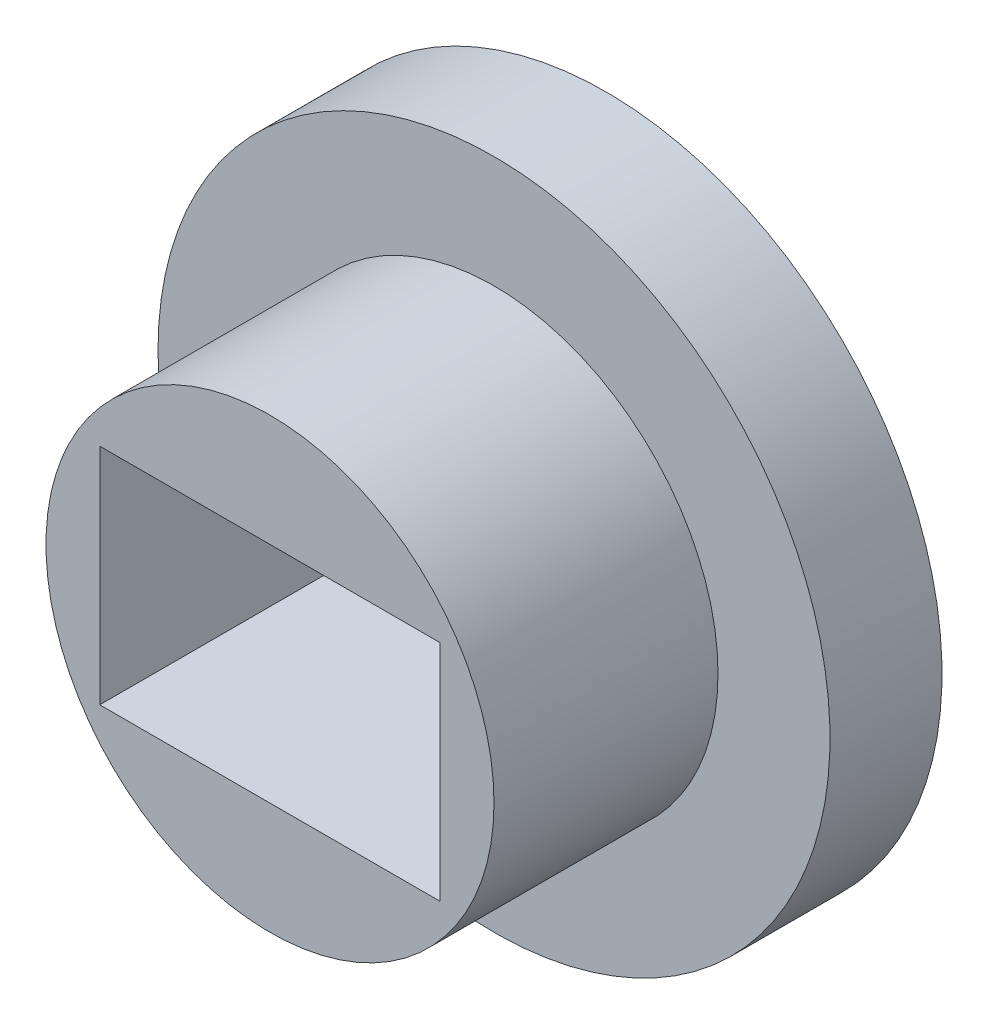
ISO-10303-21;
HEADER;
FILE_DESCRIPTION(('STEP AP214'),'2;1');
FILE_NAME('part.step','',(''),(''),'','','');
FILE_SCHEMA(('AUTOMOTIVE_DESIGN { 1 0 10303 214 1 1 1 1 }'));
ENDSEC;
DATA;
#1=APPLICATION_CONTEXT('core data for automotive mechanical design processes');
#2=APPLICATION_PROTOCOL_DEFINITION('international standard','automotive_design',2000,#1);
#3=PRODUCT_CONTEXT('',#1,'mechanical');
#4=PRODUCT('Part','Part','',(#3));
#5=PRODUCT_RELATED_PRODUCT_CATEGORY('part','',(#4));
#6=PRODUCT_DEFINITION_FORMATION('','',#4);
#7=PRODUCT_DEFINITION_CONTEXT('part definition',#1,'design');
#8=PRODUCT_DEFINITION('design','',#6,#7);
#9=PRODUCT_DEFINITION_SHAPE('','',#8);
#10=(LENGTH_UNIT() NAMED_UNIT(*) SI_UNIT(.MILLI.,.METRE.));
#11=(NAMED_UNIT(*) PLANE_ANGLE_UNIT() SI_UNIT($,.RADIAN.));
#12=(NAMED_UNIT(*) SI_UNIT($,.STERADIAN.) SOLID_ANGLE_UNIT());
#13=UNCERTAINTY_MEASURE_WITH_UNIT(LENGTH_MEASURE(1.E-05),#10,'distance_accuracy_value','');
#14=(GEOMETRIC_REPRESENTATION_CONTEXT(3) GLOBAL_UNCERTAINTY_ASSIGNED_CONTEXT((#13)) GLOBAL_UNIT_ASSIGNED_CONTEXT((#10,
#11,#12)) REPRESENTATION_CONTEXT('',''));
#15=CARTESIAN_POINT('',(0.,0.,0.));
#16=DIRECTION('',(0.,0.,1.));
#17=DIRECTION('',(1.,0.,0.));
#18=AXIS2_PLACEMENT_3D('',#15,#16,#17);
#19=CARTESIAN_POINT('',(0.,0.,6.35));
#20=DIRECTION('',(0.,0.,-1.));
#21=DIRECTION('',(-1.,0.,0.));
#22=AXIS2_PLACEMENT_3D('',#19,#20,#21);
#23=CYLINDRICAL_SURFACE('',#22,6.35);
#24=CARTESIAN_POINT('',(0.,0.,6.35));
#25=DIRECTION('',(0.,0.,1.));
#26=DIRECTION('',(1.,0.,0.));
#27=AXIS2_PLACEMENT_3D('',#24,#25,#26);
#28=CIRCLE('',#27,6.35);
#29=CARTESIAN_POINT('',(6.35,0.,6.35));
#30=VERTEX_POINT('',#29);
#31=EDGE_CURVE('E11',#30,#30,#28,.T.);
#32=ORIENTED_EDGE('',*,*,#31,.F.);
#33=EDGE_LOOP('',(#32));
#34=FACE_BOUND('',#33,.T.);
#35=CARTESIAN_POINT('',(0.,0.,0.));
#36=DIRECTION('',(0.,0.,1.));
#37=DIRECTION('',(1.,0.,0.));
#38=AXIS2_PLACEMENT_3D('',#35,#36,#37);
#39=CIRCLE('',#38,6.35);
#40=CARTESIAN_POINT('',(6.35,0.,0.));
#41=VERTEX_POINT('',#40);
#42=EDGE_CURVE('E42',#41,#41,#39,.T.);
#43=ORIENTED_EDGE('',*,*,#42,.T.);
#44=EDGE_LOOP('',(#43));
#45=FACE_BOUND('',#44,.T.);
#46=ADVANCED_FACE('F39',(#34,#45),#23,.T.);
#47=CARTESIAN_POINT('',(0.,0.,6.35));
#48=DIRECTION('',(0.,0.,1.));
#49=DIRECTION('',(1.,0.,0.));
#50=AXIS2_PLACEMENT_3D('',#47,#48,#49);
#51=PLANE('',#50);
#52=DIRECTION('',(0.,-1.,0.));
#53=VECTOR('',#52,1.);
#54=CARTESIAN_POINT('',(4.826,-3.175,6.35));
#55=LINE('',#54,#53);
#56=CARTESIAN_POINT('',(4.826,3.175,6.35));
#57=VERTEX_POINT('',#56);
#58=CARTESIAN_POINT('',(4.826,-3.175,6.35));
#59=VERTEX_POINT('',#58);
#60=EDGE_CURVE('E82',#57,#59,#55,.T.);
#61=ORIENTED_EDGE('',*,*,#60,.T.);
#62=DIRECTION('',(-1.,0.,0.));
#63=VECTOR('',#62,1.);
#64=CARTESIAN_POINT('',(-4.826,-3.175,6.35));
#65=LINE('',#64,#63);
#66=CARTESIAN_POINT('',(-4.826,-3.175,6.35));
#67=VERTEX_POINT('',#66);
#68=EDGE_CURVE('E92',#59,#67,#65,.T.);
#69=ORIENTED_EDGE('',*,*,#68,.T.);
#70=DIRECTION('',(0.,1.,0.));
#71=VECTOR('',#70,1.);
#72=CARTESIAN_POINT('',(-4.826,-3.175,6.35));
#73=LINE('',#72,#71);
#74=CARTESIAN_POINT('',(-4.826,3.175,6.35));
#75=VERTEX_POINT('',#74);
#76=EDGE_CURVE('E54',#67,#75,#73,.T.);
#77=ORIENTED_EDGE('',*,*,#76,.T.);
#78=DIRECTION('',(1.,0.,0.));
#79=VECTOR('',#78,1.);
#80=CARTESIAN_POINT('',(-4.826,3.175,6.35));
#81=LINE('',#80,#79);
#82=EDGE_CURVE('E89',#75,#57,#81,.T.);
#83=ORIENTED_EDGE('',*,*,#82,.T.);
#84=EDGE_LOOP('',(#61,#69,#77,#83));
#85=FACE_BOUND('',#84,.T.);
#86=ORIENTED_EDGE('',*,*,#31,.T.);
#87=EDGE_LOOP('',(#86));
#88=FACE_BOUND('',#87,.T.);
#89=ADVANCED_FACE('F97',(#85,#88),#51,.T.);
#90=CARTESIAN_POINT('',(0.,0.,-3.175));
#91=DIRECTION('',(0.,0.,1.));
#92=DIRECTION('',(1.,0.,0.));
#93=AXIS2_PLACEMENT_3D('',#90,#91,#92);
#94=CYLINDRICAL_SURFACE('',#93,9.525);
#95=CARTESIAN_POINT('',(0.,0.,-3.175));
#96=DIRECTION('',(0.,0.,-1.));
#97=DIRECTION('',(-1.,0.,0.));
#98=AXIS2_PLACEMENT_3D('',#95,#96,#97);
#99=CIRCLE('',#98,9.525);
#100=CARTESIAN_POINT('',(-9.525,0.,-3.175));
#101=VERTEX_POINT('',#100);
#102=EDGE_CURVE('E129',#101,#101,#99,.T.);
#103=ORIENTED_EDGE('',*,*,#102,.F.);
#104=EDGE_LOOP('',(#103));
#105=FACE_BOUND('',#104,.T.);
#106=CARTESIAN_POINT('',(0.,0.,0.));
#107=DIRECTION('',(0.,0.,-1.));
#108=DIRECTION('',(-1.,0.,0.));
#109=AXIS2_PLACEMENT_3D('',#106,#107,#108);
#110=CIRCLE('',#109,9.525);
#111=CARTESIAN_POINT('',(-9.525,0.,0.));
#112=VERTEX_POINT('',#111);
#113=EDGE_CURVE('E123',#112,#112,#110,.T.);
#114=ORIENTED_EDGE('',*,*,#113,.T.);
#115=EDGE_LOOP('',(#114));
#116=FACE_BOUND('',#115,.T.);
#117=ADVANCED_FACE('F137',(#105,#116),#94,.T.);
#118=CARTESIAN_POINT('',(0.,0.,-3.175));
#119=DIRECTION('',(0.,0.,-1.));
#120=DIRECTION('',(-1.,0.,0.));
#121=AXIS2_PLACEMENT_3D('',#118,#119,#120);
#122=PLANE('',#121);
#123=DIRECTION('',(0.,-1.,0.));
#124=VECTOR('',#123,1.);
#125=CARTESIAN_POINT('',(4.826,-3.175,-3.175));
#126=LINE('',#125,#124);
#127=CARTESIAN_POINT('',(4.826,3.175,-3.175));
#128=VERTEX_POINT('',#127);
#129=CARTESIAN_POINT('',(4.826,-3.175,-3.175));
#130=VERTEX_POINT('',#129);
#131=EDGE_CURVE('E62',#128,#130,#126,.T.);
#132=ORIENTED_EDGE('',*,*,#131,.F.);
#133=DIRECTION('',(1.,0.,0.));
#134=VECTOR('',#133,1.);
#135=CARTESIAN_POINT('',(-4.826,3.175,-3.175));
#136=LINE('',#135,#134);
#137=CARTESIAN_POINT('',(-4.826,3.175,-3.175));
#138=VERTEX_POINT('',#137);
#139=EDGE_CURVE('E101',#138,#128,#136,.T.);
#140=ORIENTED_EDGE('',*,*,#139,.F.);
#141=DIRECTION('',(0.,1.,0.));
#142=VECTOR('',#141,1.);
#143=CARTESIAN_POINT('',(-4.826,-3.175,-3.175));
#144=LINE('',#143,#142);
#145=CARTESIAN_POINT('',(-4.826,-3.175,-3.175));
#146=VERTEX_POINT('',#145);
#147=EDGE_CURVE('E105',#146,#138,#144,.T.);
#148=ORIENTED_EDGE('',*,*,#147,.F.);
#149=DIRECTION('',(-1.,0.,0.));
#150=VECTOR('',#149,1.);
#151=CARTESIAN_POINT('',(-4.826,-3.175,-3.175));
#152=LINE('',#151,#150);
#153=EDGE_CURVE('E114',#130,#146,#152,.T.);
#154=ORIENTED_EDGE('',*,*,#153,.F.);
#155=EDGE_LOOP('',(#132,#140,#148,#154));
#156=FACE_BOUND('',#155,.T.);
#157=ORIENTED_EDGE('',*,*,#102,.T.);
#158=EDGE_LOOP('',(#157));
#159=FACE_BOUND('',#158,.T.);
#160=ADVANCED_FACE('F141',(#156,#159),#122,.T.);
#161=CARTESIAN_POINT('',(0.,0.,0.));
#162=DIRECTION('',(0.,0.,-1.));
#163=DIRECTION('',(-1.,0.,0.));
#164=AXIS2_PLACEMENT_3D('',#161,#162,#163);
#165=PLANE('',#164);
#166=ORIENTED_EDGE('',*,*,#42,.F.);
#167=EDGE_LOOP('',(#166));
#168=FACE_BOUND('',#167,.T.);
#169=ORIENTED_EDGE('',*,*,#113,.F.);
#170=EDGE_LOOP('',(#169));
#171=FACE_BOUND('',#170,.T.);
#172=ADVANCED_FACE('F139',(#168,#171),#165,.F.);
#173=CARTESIAN_POINT('',(4.826,-3.175,6.35));
#174=DIRECTION('',(1.,0.,0.));
#175=DIRECTION('',(0.,0.,-1.));
#176=AXIS2_PLACEMENT_3D('',#173,#174,#175);
#177=PLANE('',#176);
#178=ORIENTED_EDGE('',*,*,#131,.T.);
#179=DIRECTION('',(0.,0.,-1.));
#180=VECTOR('',#179,1.);
#181=CARTESIAN_POINT('',(4.826,-3.175,6.35));
#182=LINE('',#181,#180);
#183=EDGE_CURVE('E78',#59,#130,#182,.T.);
#184=ORIENTED_EDGE('',*,*,#183,.F.);
#185=ORIENTED_EDGE('',*,*,#60,.F.);
#186=DIRECTION('',(0.,0.,-1.));
#187=VECTOR('',#186,1.);
#188=CARTESIAN_POINT('',(4.826,3.175,6.35));
#189=LINE('',#188,#187);
#190=EDGE_CURVE('E120',#57,#128,#189,.T.);
#191=ORIENTED_EDGE('',*,*,#190,.T.);
#192=EDGE_LOOP('',(#178,#184,#185,#191));
#193=FACE_BOUND('',#192,.T.);
#194=ADVANCED_FACE('F80',(#193),#177,.F.);
#195=CARTESIAN_POINT('',(-4.826,3.175,6.35));
#196=DIRECTION('',(0.,1.,0.));
#197=DIRECTION('',(-1.,0.,0.));
#198=AXIS2_PLACEMENT_3D('',#195,#196,#197);
#199=PLANE('',#198);
#200=ORIENTED_EDGE('',*,*,#139,.T.);
#201=ORIENTED_EDGE('',*,*,#190,.F.);
#202=ORIENTED_EDGE('',*,*,#82,.F.);
#203=DIRECTION('',(0.,0.,-1.));
#204=VECTOR('',#203,1.);
#205=CARTESIAN_POINT('',(-4.826,3.175,6.35));
#206=LINE('',#205,#204);
#207=EDGE_CURVE('E124',#75,#138,#206,.T.);
#208=ORIENTED_EDGE('',*,*,#207,.T.);
#209=EDGE_LOOP('',(#200,#201,#202,#208));
#210=FACE_BOUND('',#209,.T.);
#211=ADVANCED_FACE('F148',(#210),#199,.F.);
#212=CARTESIAN_POINT('',(-4.826,-3.175,6.35));
#213=DIRECTION('',(-1.,0.,0.));
#214=DIRECTION('',(0.,0.,1.));
#215=AXIS2_PLACEMENT_3D('',#212,#213,#214);
#216=PLANE('',#215);
#217=ORIENTED_EDGE('',*,*,#147,.T.);
#218=ORIENTED_EDGE('',*,*,#207,.F.);
#219=ORIENTED_EDGE('',*,*,#76,.F.);
#220=DIRECTION('',(0.,0.,-1.));
#221=VECTOR('',#220,1.);
#222=CARTESIAN_POINT('',(-4.826,-3.175,6.35));
#223=LINE('',#222,#221);
#224=EDGE_CURVE('E88',#67,#146,#223,.T.);
#225=ORIENTED_EDGE('',*,*,#224,.T.);
#226=EDGE_LOOP('',(#217,#218,#219,#225));
#227=FACE_BOUND('',#226,.T.);
#228=ADVANCED_FACE('F193',(#227),#216,.F.);
#229=CARTESIAN_POINT('',(-4.826,-3.175,6.35));
#230=DIRECTION('',(0.,-1.,0.));
#231=DIRECTION('',(1.,0.,0.));
#232=AXIS2_PLACEMENT_3D('',#229,#230,#231);
#233=PLANE('',#232);
#234=ORIENTED_EDGE('',*,*,#153,.T.);
#235=ORIENTED_EDGE('',*,*,#224,.F.);
#236=ORIENTED_EDGE('',*,*,#68,.F.);
#237=ORIENTED_EDGE('',*,*,#183,.T.);
#238=EDGE_LOOP('',(#234,#235,#236,#237));
#239=FACE_BOUND('',#238,.T.);
#240=ADVANCED_FACE('F93',(#239),#233,.F.);
#241=CLOSED_SHELL('',(#46,#89,#117,#160,#172,#194,#211,#228,#240));
#242=MANIFOLD_SOLID_BREP('B2',#241);
#243=ADVANCED_BREP_SHAPE_REPRESENTATION('',(#18,#242),#14);
#244=SHAPE_DEFINITION_REPRESENTATION(#9,#243);
ENDSEC;
END-ISO-10303-21;
